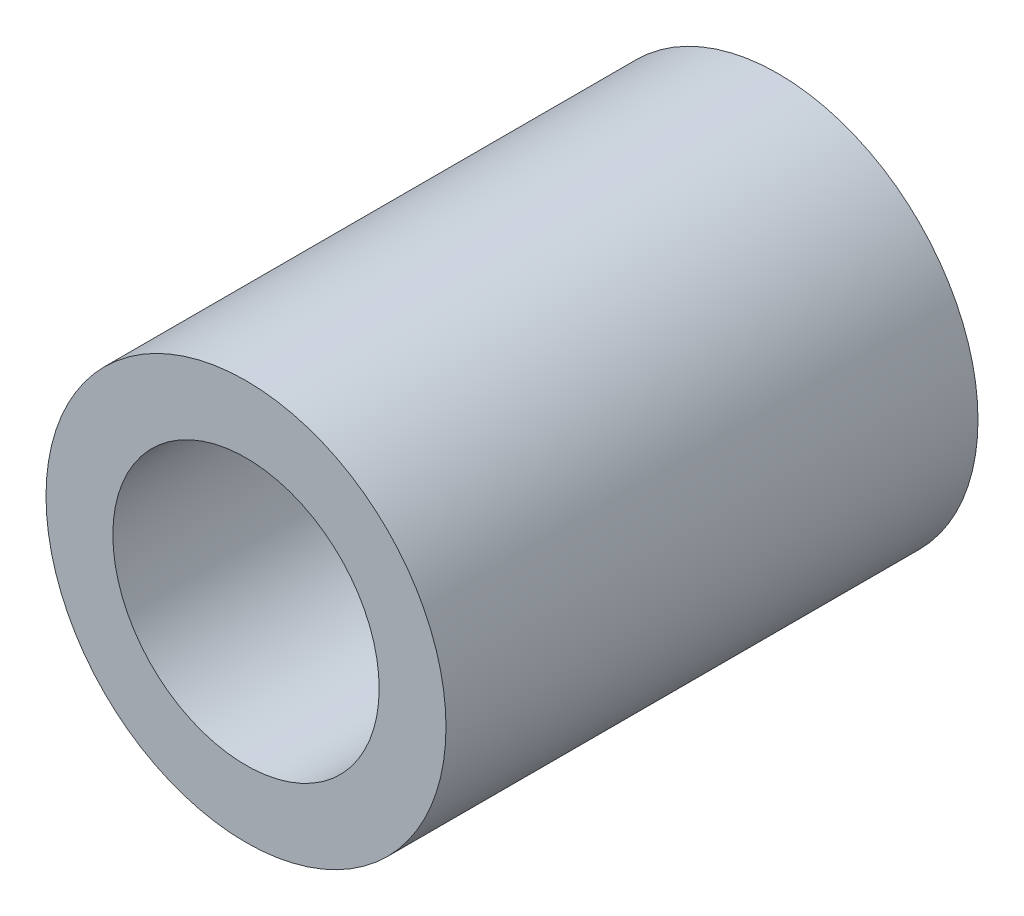
ISO-10303-21;
HEADER;
FILE_DESCRIPTION(('STEP AP214'),'2;1');
FILE_NAME('part.step','',(''),(''),'','','');
FILE_SCHEMA(('AUTOMOTIVE_DESIGN { 1 0 10303 214 1 1 1 1 }'));
ENDSEC;
DATA;
#1=APPLICATION_CONTEXT('core data for automotive mechanical design processes');
#2=APPLICATION_PROTOCOL_DEFINITION('international standard','automotive_design',2000,#1);
#3=PRODUCT_CONTEXT('',#1,'mechanical');
#4=PRODUCT('Part','Part','',(#3));
#5=PRODUCT_RELATED_PRODUCT_CATEGORY('part','',(#4));
#6=PRODUCT_DEFINITION_FORMATION('','',#4);
#7=PRODUCT_DEFINITION_CONTEXT('part definition',#1,'design');
#8=PRODUCT_DEFINITION('design','',#6,#7);
#9=PRODUCT_DEFINITION_SHAPE('','',#8);
#10=(LENGTH_UNIT() NAMED_UNIT(*) SI_UNIT(.MILLI.,.METRE.));
#11=(NAMED_UNIT(*) PLANE_ANGLE_UNIT() SI_UNIT($,.RADIAN.));
#12=(NAMED_UNIT(*) SI_UNIT($,.STERADIAN.) SOLID_ANGLE_UNIT());
#13=UNCERTAINTY_MEASURE_WITH_UNIT(LENGTH_MEASURE(1.E-05),#10,'distance_accuracy_value','');
#14=(GEOMETRIC_REPRESENTATION_CONTEXT(3) GLOBAL_UNCERTAINTY_ASSIGNED_CONTEXT((#13)) GLOBAL_UNIT_ASSIGNED_CONTEXT((#10,
#11,#12)) REPRESENTATION_CONTEXT('',''));
#15=CARTESIAN_POINT('',(0.,0.,0.));
#16=DIRECTION('',(0.,0.,1.));
#17=DIRECTION('',(1.,0.,0.));
#18=AXIS2_PLACEMENT_3D('',#15,#16,#17);
#19=CARTESIAN_POINT('',(0.,0.,-8.));
#20=DIRECTION('',(0.,0.,1.));
#21=DIRECTION('',(1.,0.,0.));
#22=AXIS2_PLACEMENT_3D('',#19,#20,#21);
#23=PLANE('',#22);
#24=CARTESIAN_POINT('',(0.,0.,-8.));
#25=DIRECTION('',(0.,0.,1.));
#26=DIRECTION('',(1.,0.,0.));
#27=AXIS2_PLACEMENT_3D('',#24,#25,#26);
#28=CIRCLE('',#27,4.005);
#29=CARTESIAN_POINT('',(4.005,0.,-8.));
#30=VERTEX_POINT('',#29);
#31=EDGE_CURVE('E47',#30,#30,#28,.T.);
#32=ORIENTED_EDGE('',*,*,#31,.T.);
#33=EDGE_LOOP('',(#32));
#34=FACE_BOUND('',#33,.T.);
#35=CARTESIAN_POINT('',(0.,0.,-8.));
#36=DIRECTION('',(0.,0.,1.));
#37=DIRECTION('',(1.,0.,0.));
#38=AXIS2_PLACEMENT_3D('',#35,#36,#37);
#39=CIRCLE('',#38,6.015);
#40=CARTESIAN_POINT('',(6.015,0.,-8.));
#41=VERTEX_POINT('',#40);
#42=EDGE_CURVE('E21',#41,#41,#39,.T.);
#43=ORIENTED_EDGE('',*,*,#42,.F.);
#44=EDGE_LOOP('',(#43));
#45=FACE_BOUND('',#44,.T.);
#46=ADVANCED_FACE('F17',(#34,#45),#23,.F.);
#47=CARTESIAN_POINT('',(0.,0.,8.));
#48=DIRECTION('',(0.,0.,1.));
#49=DIRECTION('',(1.,0.,0.));
#50=AXIS2_PLACEMENT_3D('',#47,#48,#49);
#51=PLANE('',#50);
#52=CARTESIAN_POINT('',(0.,0.,8.));
#53=DIRECTION('',(0.,0.,1.));
#54=DIRECTION('',(1.,0.,0.));
#55=AXIS2_PLACEMENT_3D('',#52,#53,#54);
#56=CIRCLE('',#55,4.005);
#57=CARTESIAN_POINT('',(4.005,0.,8.));
#58=VERTEX_POINT('',#57);
#59=EDGE_CURVE('E57',#58,#58,#56,.T.);
#60=ORIENTED_EDGE('',*,*,#59,.F.);
#61=EDGE_LOOP('',(#60));
#62=FACE_BOUND('',#61,.T.);
#63=CARTESIAN_POINT('',(0.,0.,8.));
#64=DIRECTION('',(0.,0.,1.));
#65=DIRECTION('',(1.,0.,0.));
#66=AXIS2_PLACEMENT_3D('',#63,#64,#65);
#67=CIRCLE('',#66,6.015);
#68=CARTESIAN_POINT('',(6.015,0.,8.));
#69=VERTEX_POINT('',#68);
#70=EDGE_CURVE('E11',#69,#69,#67,.T.);
#71=ORIENTED_EDGE('',*,*,#70,.T.);
#72=EDGE_LOOP('',(#71));
#73=FACE_BOUND('',#72,.T.);
#74=ADVANCED_FACE('F19',(#62,#73),#51,.T.);
#75=CARTESIAN_POINT('',(0.,0.,8.));
#76=DIRECTION('',(0.,0.,-1.));
#77=DIRECTION('',(-1.,0.,0.));
#78=AXIS2_PLACEMENT_3D('',#75,#76,#77);
#79=CYLINDRICAL_SURFACE('',#78,6.015);
#80=ORIENTED_EDGE('',*,*,#42,.T.);
#81=DIRECTION('',(0.,0.,1.));
#82=VECTOR('',#81,1.);
#83=CARTESIAN_POINT('',(6.015,0.,8.));
#84=LINE('',#83,#82);
#85=EDGE_CURVE('E28',#41,#69,#84,.T.);
#86=ORIENTED_EDGE('',*,*,#85,.T.);
#87=ORIENTED_EDGE('',*,*,#70,.F.);
#88=ORIENTED_EDGE('',*,*,#85,.F.);
#89=EDGE_LOOP('',(#80,#86,#87,#88));
#90=FACE_BOUND('',#89,.T.);
#91=ADVANCED_FACE('F77',(#90),#79,.T.);
#92=CARTESIAN_POINT('',(0.,0.,8.));
#93=DIRECTION('',(0.,0.,-1.));
#94=DIRECTION('',(-1.,0.,0.));
#95=AXIS2_PLACEMENT_3D('',#92,#93,#94);
#96=CYLINDRICAL_SURFACE('',#95,4.005);
#97=ORIENTED_EDGE('',*,*,#59,.T.);
#98=DIRECTION('',(0.,0.,-1.));
#99=VECTOR('',#98,1.);
#100=CARTESIAN_POINT('',(4.005,0.,8.));
#101=LINE('',#100,#99);
#102=EDGE_CURVE('E54',#58,#30,#101,.T.);
#103=ORIENTED_EDGE('',*,*,#102,.T.);
#104=ORIENTED_EDGE('',*,*,#31,.F.);
#105=ORIENTED_EDGE('',*,*,#102,.F.);
#106=EDGE_LOOP('',(#97,#103,#104,#105));
#107=FACE_BOUND('',#106,.T.);
#108=ADVANCED_FACE('F55',(#107),#96,.F.);
#109=CLOSED_SHELL('',(#46,#74,#91,#108));
#110=MANIFOLD_SOLID_BREP('B1',#109);
#111=ADVANCED_BREP_SHAPE_REPRESENTATION('',(#18,#110),#14);
#112=SHAPE_DEFINITION_REPRESENTATION(#9,#111);
ENDSEC;
END-ISO-10303-21;
